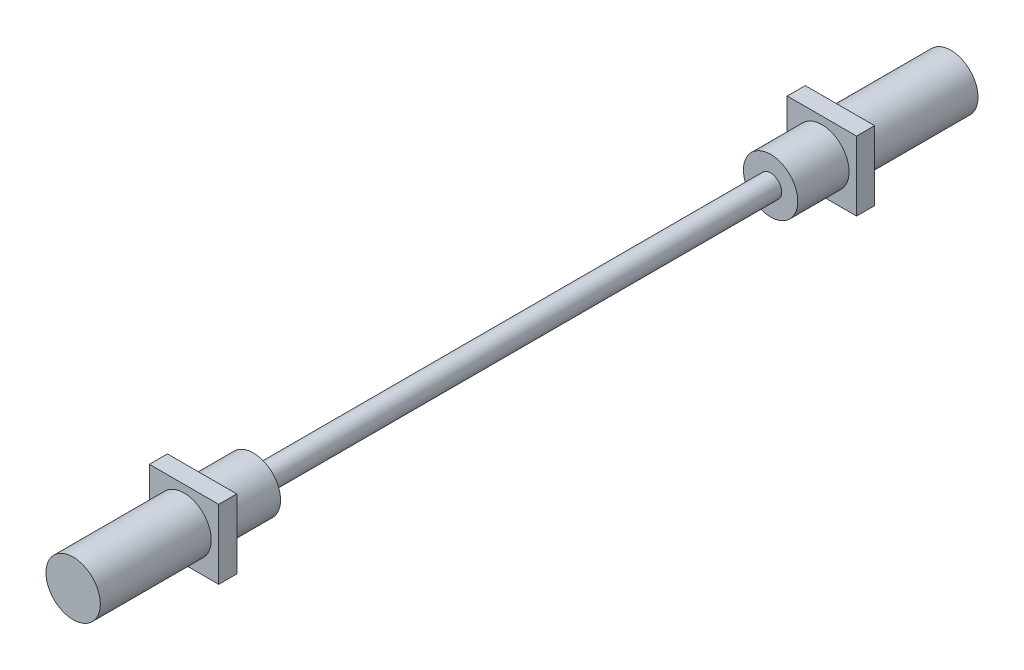
ISO-10303-21;
HEADER;
FILE_DESCRIPTION(('STEP AP214'),'2;1');
FILE_NAME('part.step','',(''),(''),'','','');
FILE_SCHEMA(('AUTOMOTIVE_DESIGN { 1 0 10303 214 1 1 1 1 }'));
ENDSEC;
DATA;
#1=APPLICATION_CONTEXT('core data for automotive mechanical design processes');
#2=APPLICATION_PROTOCOL_DEFINITION('international standard','automotive_design',2000,#1);
#3=PRODUCT_CONTEXT('',#1,'mechanical');
#4=PRODUCT('Part','Part','',(#3));
#5=PRODUCT_RELATED_PRODUCT_CATEGORY('part','',(#4));
#6=PRODUCT_DEFINITION_FORMATION('','',#4);
#7=PRODUCT_DEFINITION_CONTEXT('part definition',#1,'design');
#8=PRODUCT_DEFINITION('design','',#6,#7);
#9=PRODUCT_DEFINITION_SHAPE('','',#8);
#10=(LENGTH_UNIT() NAMED_UNIT(*) SI_UNIT(.MILLI.,.METRE.));
#11=(NAMED_UNIT(*) PLANE_ANGLE_UNIT() SI_UNIT($,.RADIAN.));
#12=(NAMED_UNIT(*) SI_UNIT($,.STERADIAN.) SOLID_ANGLE_UNIT());
#13=UNCERTAINTY_MEASURE_WITH_UNIT(LENGTH_MEASURE(1.E-05),#10,'distance_accuracy_value','');
#14=(GEOMETRIC_REPRESENTATION_CONTEXT(3) GLOBAL_UNCERTAINTY_ASSIGNED_CONTEXT((#13)) GLOBAL_UNIT_ASSIGNED_CONTEXT((#10,
#11,#12)) REPRESENTATION_CONTEXT('',''));
#15=CARTESIAN_POINT('',(0.,0.,0.));
#16=DIRECTION('',(0.,0.,1.));
#17=DIRECTION('',(1.,0.,0.));
#18=AXIS2_PLACEMENT_3D('',#15,#16,#17);
#19=CARTESIAN_POINT('',(0.,0.,47.371));
#20=DIRECTION('',(0.,0.,-1.));
#21=DIRECTION('',(-1.,0.,0.));
#22=AXIS2_PLACEMENT_3D('',#19,#20,#21);
#23=CYLINDRICAL_SURFACE('',#22,1.016);
#24=CARTESIAN_POINT('',(0.,0.,47.371));
#25=DIRECTION('',(0.,0.,1.));
#26=DIRECTION('',(1.,0.,0.));
#27=AXIS2_PLACEMENT_3D('',#24,#25,#26);
#28=CIRCLE('',#27,1.016);
#29=CARTESIAN_POINT('',(1.016,0.,47.371));
#30=VERTEX_POINT('',#29);
#31=EDGE_CURVE('E164',#30,#30,#28,.T.);
#32=ORIENTED_EDGE('',*,*,#31,.F.);
#33=EDGE_LOOP('',(#32));
#34=FACE_BOUND('',#33,.T.);
#35=CARTESIAN_POINT('',(0.,0.,0.));
#36=DIRECTION('',(0.,0.,1.));
#37=DIRECTION('',(1.,0.,0.));
#38=AXIS2_PLACEMENT_3D('',#35,#36,#37);
#39=CIRCLE('',#38,1.016);
#40=CARTESIAN_POINT('',(1.016,0.,0.));
#41=VERTEX_POINT('',#40);
#42=EDGE_CURVE('E48',#41,#41,#39,.T.);
#43=ORIENTED_EDGE('',*,*,#42,.T.);
#44=EDGE_LOOP('',(#43));
#45=FACE_BOUND('',#44,.T.);
#46=ADVANCED_FACE('F45',(#34,#45),#23,.T.);
#47=CARTESIAN_POINT('',(0.,0.,-4.699));
#48=DIRECTION('',(0.,0.,1.));
#49=DIRECTION('',(1.,0.,0.));
#50=AXIS2_PLACEMENT_3D('',#47,#48,#49);
#51=CYLINDRICAL_SURFACE('',#50,2.4892);
#52=CARTESIAN_POINT('',(0.,0.,-4.699));
#53=DIRECTION('',(0.,0.,-1.));
#54=DIRECTION('',(-1.,0.,0.));
#55=AXIS2_PLACEMENT_3D('',#52,#53,#54);
#56=CIRCLE('',#55,2.4892);
#57=CARTESIAN_POINT('',(-2.4892,0.,-4.699));
#58=VERTEX_POINT('',#57);
#59=EDGE_CURVE('E186',#58,#58,#56,.T.);
#60=ORIENTED_EDGE('',*,*,#59,.F.);
#61=EDGE_LOOP('',(#60));
#62=FACE_BOUND('',#61,.T.);
#63=CARTESIAN_POINT('',(0.,0.,0.));
#64=DIRECTION('',(0.,0.,-1.));
#65=DIRECTION('',(-1.,0.,0.));
#66=AXIS2_PLACEMENT_3D('',#63,#64,#65);
#67=CIRCLE('',#66,2.4892);
#68=CARTESIAN_POINT('',(-2.4892,0.,0.));
#69=VERTEX_POINT('',#68);
#70=EDGE_CURVE('E185',#69,#69,#67,.T.);
#71=ORIENTED_EDGE('',*,*,#70,.T.);
#72=EDGE_LOOP('',(#71));
#73=FACE_BOUND('',#72,.T.);
#74=ADVANCED_FACE('F201',(#62,#73),#51,.T.);
#75=CARTESIAN_POINT('',(0.,0.,0.));
#76=DIRECTION('',(0.,0.,-1.));
#77=DIRECTION('',(-1.,0.,0.));
#78=AXIS2_PLACEMENT_3D('',#75,#76,#77);
#79=PLANE('',#78);
#80=ORIENTED_EDGE('',*,*,#42,.F.);
#81=EDGE_LOOP('',(#80));
#82=FACE_BOUND('',#81,.T.);
#83=ORIENTED_EDGE('',*,*,#70,.F.);
#84=EDGE_LOOP('',(#83));
#85=FACE_BOUND('',#84,.T.);
#86=ADVANCED_FACE('F197',(#82,#85),#79,.F.);
#87=CARTESIAN_POINT('',(-3.175,3.175,-6.35));
#88=DIRECTION('',(1.,0.,0.));
#89=DIRECTION('',(0.,1.,0.));
#90=AXIS2_PLACEMENT_3D('',#87,#88,#89);
#91=PLANE('',#90);
#92=DIRECTION('',(0.,1.,0.));
#93=VECTOR('',#92,1.);
#94=CARTESIAN_POINT('',(-3.175,3.175,-4.699));
#95=LINE('',#94,#93);
#96=CARTESIAN_POINT('',(-3.175,-3.175,-4.699));
#97=VERTEX_POINT('',#96);
#98=CARTESIAN_POINT('',(-3.175,3.175,-4.699));
#99=VERTEX_POINT('',#98);
#100=EDGE_CURVE('E161',#97,#99,#95,.T.);
#101=ORIENTED_EDGE('',*,*,#100,.T.);
#102=DIRECTION('',(0.,0.,1.));
#103=VECTOR('',#102,1.);
#104=CARTESIAN_POINT('',(-3.175,3.175,-6.35));
#105=LINE('',#104,#103);
#106=CARTESIAN_POINT('',(-3.175,3.175,-6.35));
#107=VERTEX_POINT('',#106);
#108=EDGE_CURVE('E183',#107,#99,#105,.T.);
#109=ORIENTED_EDGE('',*,*,#108,.F.);
#110=DIRECTION('',(0.,1.,0.));
#111=VECTOR('',#110,1.);
#112=CARTESIAN_POINT('',(-3.175,3.175,-6.35));
#113=LINE('',#112,#111);
#114=CARTESIAN_POINT('',(-3.175,-3.175,-6.35));
#115=VERTEX_POINT('',#114);
#116=EDGE_CURVE('E165',#115,#107,#113,.T.);
#117=ORIENTED_EDGE('',*,*,#116,.F.);
#118=DIRECTION('',(0.,0.,1.));
#119=VECTOR('',#118,1.);
#120=CARTESIAN_POINT('',(-3.175,-3.175,-6.35));
#121=LINE('',#120,#119);
#122=EDGE_CURVE('E171',#115,#97,#121,.T.);
#123=ORIENTED_EDGE('',*,*,#122,.T.);
#124=EDGE_LOOP('',(#101,#109,#117,#123));
#125=FACE_BOUND('',#124,.T.);
#126=ADVANCED_FACE('F200',(#125),#91,.F.);
#127=CARTESIAN_POINT('',(3.175,3.175,-6.35));
#128=DIRECTION('',(0.,-1.,0.));
#129=DIRECTION('',(0.,0.,-1.));
#130=AXIS2_PLACEMENT_3D('',#127,#128,#129);
#131=PLANE('',#130);
#132=DIRECTION('',(1.,0.,0.));
#133=VECTOR('',#132,1.);
#134=CARTESIAN_POINT('',(3.175,3.175,-4.699));
#135=LINE('',#134,#133);
#136=CARTESIAN_POINT('',(3.175,3.175,-4.699));
#137=VERTEX_POINT('',#136);
#138=EDGE_CURVE('E174',#99,#137,#135,.T.);
#139=ORIENTED_EDGE('',*,*,#138,.T.);
#140=DIRECTION('',(0.,0.,1.));
#141=VECTOR('',#140,1.);
#142=CARTESIAN_POINT('',(3.175,3.175,-6.35));
#143=LINE('',#142,#141);
#144=CARTESIAN_POINT('',(3.175,3.175,-6.35));
#145=VERTEX_POINT('',#144);
#146=EDGE_CURVE('E181',#145,#137,#143,.T.);
#147=ORIENTED_EDGE('',*,*,#146,.F.);
#148=DIRECTION('',(1.,0.,0.));
#149=VECTOR('',#148,1.);
#150=CARTESIAN_POINT('',(3.175,3.175,-6.35));
#151=LINE('',#150,#149);
#152=EDGE_CURVE('E95',#107,#145,#151,.T.);
#153=ORIENTED_EDGE('',*,*,#152,.F.);
#154=ORIENTED_EDGE('',*,*,#108,.T.);
#155=EDGE_LOOP('',(#139,#147,#153,#154));
#156=FACE_BOUND('',#155,.T.);
#157=ADVANCED_FACE('F215',(#156),#131,.F.);
#158=CARTESIAN_POINT('',(3.175,3.175,-6.35));
#159=DIRECTION('',(-1.,0.,0.));
#160=DIRECTION('',(0.,-1.,0.));
#161=AXIS2_PLACEMENT_3D('',#158,#159,#160);
#162=PLANE('',#161);
#163=DIRECTION('',(0.,-1.,0.));
#164=VECTOR('',#163,1.);
#165=CARTESIAN_POINT('',(3.175,3.175,-4.699));
#166=LINE('',#165,#164);
#167=CARTESIAN_POINT('',(3.175,-3.175,-4.699));
#168=VERTEX_POINT('',#167);
#169=EDGE_CURVE('E81',#137,#168,#166,.T.);
#170=ORIENTED_EDGE('',*,*,#169,.T.);
#171=DIRECTION('',(0.,0.,1.));
#172=VECTOR('',#171,1.);
#173=CARTESIAN_POINT('',(3.175,-3.175,-6.35));
#174=LINE('',#173,#172);
#175=CARTESIAN_POINT('',(3.175,-3.175,-6.35));
#176=VERTEX_POINT('',#175);
#177=EDGE_CURVE('E179',#176,#168,#174,.T.);
#178=ORIENTED_EDGE('',*,*,#177,.F.);
#179=DIRECTION('',(0.,-1.,0.));
#180=VECTOR('',#179,1.);
#181=CARTESIAN_POINT('',(3.175,3.175,-6.35));
#182=LINE('',#181,#180);
#183=EDGE_CURVE('E168',#145,#176,#182,.T.);
#184=ORIENTED_EDGE('',*,*,#183,.F.);
#185=ORIENTED_EDGE('',*,*,#146,.T.);
#186=EDGE_LOOP('',(#170,#178,#184,#185));
#187=FACE_BOUND('',#186,.T.);
#188=ADVANCED_FACE('F219',(#187),#162,.F.);
#189=CARTESIAN_POINT('',(3.175,-3.175,-6.35));
#190=DIRECTION('',(0.,1.,0.));
#191=DIRECTION('',(0.,0.,1.));
#192=AXIS2_PLACEMENT_3D('',#189,#190,#191);
#193=PLANE('',#192);
#194=DIRECTION('',(-1.,0.,0.));
#195=VECTOR('',#194,1.);
#196=CARTESIAN_POINT('',(3.175,-3.175,-4.699));
#197=LINE('',#196,#195);
#198=EDGE_CURVE('E87',#168,#97,#197,.T.);
#199=ORIENTED_EDGE('',*,*,#198,.T.);
#200=ORIENTED_EDGE('',*,*,#122,.F.);
#201=DIRECTION('',(-1.,0.,0.));
#202=VECTOR('',#201,1.);
#203=CARTESIAN_POINT('',(3.175,-3.175,-6.35));
#204=LINE('',#203,#202);
#205=EDGE_CURVE('E63',#176,#115,#204,.T.);
#206=ORIENTED_EDGE('',*,*,#205,.F.);
#207=ORIENTED_EDGE('',*,*,#177,.T.);
#208=EDGE_LOOP('',(#199,#200,#206,#207));
#209=FACE_BOUND('',#208,.T.);
#210=ADVANCED_FACE('F222',(#209),#193,.F.);
#211=CARTESIAN_POINT('',(0.,0.,-6.35));
#212=DIRECTION('',(0.,0.,-1.));
#213=DIRECTION('',(-1.,0.,0.));
#214=AXIS2_PLACEMENT_3D('',#211,#212,#213);
#215=PLANE('',#214);
#216=CARTESIAN_POINT('',(0.,0.,-6.35));
#217=DIRECTION('',(0.,0.,-1.));
#218=DIRECTION('',(-1.,0.,0.));
#219=AXIS2_PLACEMENT_3D('',#216,#217,#218);
#220=CIRCLE('',#219,2.4892);
#221=CARTESIAN_POINT('',(-2.4892,0.,-6.35));
#222=VERTEX_POINT('',#221);
#223=EDGE_CURVE('E54',#222,#222,#220,.T.);
#224=ORIENTED_EDGE('',*,*,#223,.F.);
#225=EDGE_LOOP('',(#224));
#226=FACE_BOUND('',#225,.T.);
#227=ORIENTED_EDGE('',*,*,#116,.T.);
#228=ORIENTED_EDGE('',*,*,#152,.T.);
#229=ORIENTED_EDGE('',*,*,#183,.T.);
#230=ORIENTED_EDGE('',*,*,#205,.T.);
#231=EDGE_LOOP('',(#227,#228,#229,#230));
#232=FACE_BOUND('',#231,.T.);
#233=ADVANCED_FACE('F225',(#226,#232),#215,.T.);
#234=CARTESIAN_POINT('',(0.,0.,-4.699));
#235=DIRECTION('',(0.,0.,-1.));
#236=DIRECTION('',(-1.,0.,0.));
#237=AXIS2_PLACEMENT_3D('',#234,#235,#236);
#238=PLANE('',#237);
#239=ORIENTED_EDGE('',*,*,#59,.T.);
#240=EDGE_LOOP('',(#239));
#241=FACE_BOUND('',#240,.T.);
#242=ORIENTED_EDGE('',*,*,#100,.F.);
#243=ORIENTED_EDGE('',*,*,#198,.F.);
#244=ORIENTED_EDGE('',*,*,#169,.F.);
#245=ORIENTED_EDGE('',*,*,#138,.F.);
#246=EDGE_LOOP('',(#242,#243,#244,#245));
#247=FACE_BOUND('',#246,.T.);
#248=ADVANCED_FACE('F226',(#241,#247),#238,.F.);
#249=CARTESIAN_POINT('',(0.,0.,-16.51));
#250=DIRECTION('',(0.,0.,1.));
#251=DIRECTION('',(1.,0.,0.));
#252=AXIS2_PLACEMENT_3D('',#249,#250,#251);
#253=CYLINDRICAL_SURFACE('',#252,2.4892);
#254=CARTESIAN_POINT('',(0.,0.,-16.51));
#255=DIRECTION('',(0.,0.,-1.));
#256=DIRECTION('',(-1.,0.,0.));
#257=AXIS2_PLACEMENT_3D('',#254,#255,#256);
#258=CIRCLE('',#257,2.4892);
#259=CARTESIAN_POINT('',(-2.4892,0.,-16.51));
#260=VERTEX_POINT('',#259);
#261=EDGE_CURVE('E157',#260,#260,#258,.T.);
#262=ORIENTED_EDGE('',*,*,#261,.F.);
#263=EDGE_LOOP('',(#262));
#264=FACE_BOUND('',#263,.T.);
#265=ORIENTED_EDGE('',*,*,#223,.T.);
#266=EDGE_LOOP('',(#265));
#267=FACE_BOUND('',#266,.T.);
#268=ADVANCED_FACE('F229',(#264,#267),#253,.T.);
#269=CARTESIAN_POINT('',(0.,0.,-16.51));
#270=DIRECTION('',(0.,0.,-1.));
#271=DIRECTION('',(-1.,0.,0.));
#272=AXIS2_PLACEMENT_3D('',#269,#270,#271);
#273=PLANE('',#272);
#274=ORIENTED_EDGE('',*,*,#261,.T.);
#275=EDGE_LOOP('',(#274));
#276=FACE_BOUND('',#275,.T.);
#277=ADVANCED_FACE('F236',(#276),#273,.T.);
#278=CARTESIAN_POINT('',(0.,0.,52.07));
#279=DIRECTION('',(0.,0.,-1.));
#280=DIRECTION('',(-1.,0.,0.));
#281=AXIS2_PLACEMENT_3D('',#278,#279,#280);
#282=CYLINDRICAL_SURFACE('',#281,2.4892);
#283=CARTESIAN_POINT('',(0.,0.,52.07));
#284=DIRECTION('',(0.,0.,1.));
#285=DIRECTION('',(1.,0.,0.));
#286=AXIS2_PLACEMENT_3D('',#283,#284,#285);
#287=CIRCLE('',#286,2.4892);
#288=CARTESIAN_POINT('',(2.4892,0.,52.07));
#289=VERTEX_POINT('',#288);
#290=EDGE_CURVE('E150',#289,#289,#287,.T.);
#291=ORIENTED_EDGE('',*,*,#290,.F.);
#292=EDGE_LOOP('',(#291));
#293=FACE_BOUND('',#292,.T.);
#294=CARTESIAN_POINT('',(0.,0.,47.371));
#295=DIRECTION('',(0.,0.,1.));
#296=DIRECTION('',(1.,0.,0.));
#297=AXIS2_PLACEMENT_3D('',#294,#295,#296);
#298=CIRCLE('',#297,2.4892);
#299=CARTESIAN_POINT('',(2.4892,0.,47.371));
#300=VERTEX_POINT('',#299);
#301=EDGE_CURVE('E147',#300,#300,#298,.T.);
#302=ORIENTED_EDGE('',*,*,#301,.T.);
#303=EDGE_LOOP('',(#302));
#304=FACE_BOUND('',#303,.T.);
#305=ADVANCED_FACE('F240',(#293,#304),#282,.T.);
#306=CARTESIAN_POINT('',(0.,0.,47.371));
#307=DIRECTION('',(0.,0.,1.));
#308=DIRECTION('',(1.,0.,0.));
#309=AXIS2_PLACEMENT_3D('',#306,#307,#308);
#310=PLANE('',#309);
#311=ORIENTED_EDGE('',*,*,#31,.T.);
#312=EDGE_LOOP('',(#311));
#313=FACE_BOUND('',#312,.T.);
#314=ORIENTED_EDGE('',*,*,#301,.F.);
#315=EDGE_LOOP('',(#314));
#316=FACE_BOUND('',#315,.T.);
#317=ADVANCED_FACE('F244',(#313,#316),#310,.F.);
#318=CARTESIAN_POINT('',(3.175,3.175,53.721));
#319=DIRECTION('',(-1.,0.,0.));
#320=DIRECTION('',(0.,-1.,0.));
#321=AXIS2_PLACEMENT_3D('',#318,#319,#320);
#322=PLANE('',#321);
#323=DIRECTION('',(0.,1.,0.));
#324=VECTOR('',#323,1.);
#325=CARTESIAN_POINT('',(3.175,3.175,52.07));
#326=LINE('',#325,#324);
#327=CARTESIAN_POINT('',(3.175,-3.175,52.07));
#328=VERTEX_POINT('',#327);
#329=CARTESIAN_POINT('',(3.175,3.175,52.07));
#330=VERTEX_POINT('',#329);
#331=EDGE_CURVE('E146',#328,#330,#326,.T.);
#332=ORIENTED_EDGE('',*,*,#331,.T.);
#333=DIRECTION('',(0.,0.,-1.));
#334=VECTOR('',#333,1.);
#335=CARTESIAN_POINT('',(3.175,3.175,53.721));
#336=LINE('',#335,#334);
#337=CARTESIAN_POINT('',(3.175,3.175,53.721));
#338=VERTEX_POINT('',#337);
#339=EDGE_CURVE('E126',#338,#330,#336,.T.);
#340=ORIENTED_EDGE('',*,*,#339,.F.);
#341=DIRECTION('',(0.,1.,0.));
#342=VECTOR('',#341,1.);
#343=CARTESIAN_POINT('',(3.175,3.175,53.721));
#344=LINE('',#343,#342);
#345=CARTESIAN_POINT('',(3.175,-3.175,53.721));
#346=VERTEX_POINT('',#345);
#347=EDGE_CURVE('E133',#346,#338,#344,.T.);
#348=ORIENTED_EDGE('',*,*,#347,.F.);
#349=DIRECTION('',(0.,0.,-1.));
#350=VECTOR('',#349,1.);
#351=CARTESIAN_POINT('',(3.175,-3.175,53.721));
#352=LINE('',#351,#350);
#353=EDGE_CURVE('E284',#346,#328,#352,.T.);
#354=ORIENTED_EDGE('',*,*,#353,.T.);
#355=EDGE_LOOP('',(#332,#340,#348,#354));
#356=FACE_BOUND('',#355,.T.);
#357=ADVANCED_FACE('F144',(#356),#322,.F.);
#358=CARTESIAN_POINT('',(-3.175,3.175,53.721));
#359=DIRECTION('',(0.,-1.,0.));
#360=DIRECTION('',(0.,0.,-1.));
#361=AXIS2_PLACEMENT_3D('',#358,#359,#360);
#362=PLANE('',#361);
#363=DIRECTION('',(-1.,0.,0.));
#364=VECTOR('',#363,1.);
#365=CARTESIAN_POINT('',(-3.175,3.175,52.07));
#366=LINE('',#365,#364);
#367=CARTESIAN_POINT('',(-3.175,3.175,52.07));
#368=VERTEX_POINT('',#367);
#369=EDGE_CURVE('E280',#330,#368,#366,.T.);
#370=ORIENTED_EDGE('',*,*,#369,.T.);
#371=DIRECTION('',(0.,0.,-1.));
#372=VECTOR('',#371,1.);
#373=CARTESIAN_POINT('',(-3.175,3.175,53.721));
#374=LINE('',#373,#372);
#375=CARTESIAN_POINT('',(-3.175,3.175,53.721));
#376=VERTEX_POINT('',#375);
#377=EDGE_CURVE('E129',#376,#368,#374,.T.);
#378=ORIENTED_EDGE('',*,*,#377,.F.);
#379=DIRECTION('',(-1.,0.,0.));
#380=VECTOR('',#379,1.);
#381=CARTESIAN_POINT('',(-3.175,3.175,53.721));
#382=LINE('',#381,#380);
#383=EDGE_CURVE('E122',#338,#376,#382,.T.);
#384=ORIENTED_EDGE('',*,*,#383,.F.);
#385=ORIENTED_EDGE('',*,*,#339,.T.);
#386=EDGE_LOOP('',(#370,#378,#384,#385));
#387=FACE_BOUND('',#386,.T.);
#388=ADVANCED_FACE('F124',(#387),#362,.F.);
#389=CARTESIAN_POINT('',(-3.175,3.175,53.721));
#390=DIRECTION('',(1.,0.,0.));
#391=DIRECTION('',(0.,1.,0.));
#392=AXIS2_PLACEMENT_3D('',#389,#390,#391);
#393=PLANE('',#392);
#394=DIRECTION('',(0.,-1.,0.));
#395=VECTOR('',#394,1.);
#396=CARTESIAN_POINT('',(-3.175,3.175,52.07));
#397=LINE('',#396,#395);
#398=CARTESIAN_POINT('',(-3.175,-3.175,52.07));
#399=VERTEX_POINT('',#398);
#400=EDGE_CURVE('E287',#368,#399,#397,.T.);
#401=ORIENTED_EDGE('',*,*,#400,.T.);
#402=DIRECTION('',(0.,0.,-1.));
#403=VECTOR('',#402,1.);
#404=CARTESIAN_POINT('',(-3.175,-3.175,53.721));
#405=LINE('',#404,#403);
#406=CARTESIAN_POINT('',(-3.175,-3.175,53.721));
#407=VERTEX_POINT('',#406);
#408=EDGE_CURVE('E152',#407,#399,#405,.T.);
#409=ORIENTED_EDGE('',*,*,#408,.F.);
#410=DIRECTION('',(0.,-1.,0.));
#411=VECTOR('',#410,1.);
#412=CARTESIAN_POINT('',(-3.175,3.175,53.721));
#413=LINE('',#412,#411);
#414=EDGE_CURVE('E132',#376,#407,#413,.T.);
#415=ORIENTED_EDGE('',*,*,#414,.F.);
#416=ORIENTED_EDGE('',*,*,#377,.T.);
#417=EDGE_LOOP('',(#401,#409,#415,#416));
#418=FACE_BOUND('',#417,.T.);
#419=ADVANCED_FACE('F252',(#418),#393,.F.);
#420=CARTESIAN_POINT('',(-3.175,-3.175,53.721));
#421=DIRECTION('',(0.,1.,0.));
#422=DIRECTION('',(0.,0.,1.));
#423=AXIS2_PLACEMENT_3D('',#420,#421,#422);
#424=PLANE('',#423);
#425=DIRECTION('',(1.,0.,0.));
#426=VECTOR('',#425,1.);
#427=CARTESIAN_POINT('',(-3.175,-3.175,52.07));
#428=LINE('',#427,#426);
#429=EDGE_CURVE('E142',#399,#328,#428,.T.);
#430=ORIENTED_EDGE('',*,*,#429,.T.);
#431=ORIENTED_EDGE('',*,*,#353,.F.);
#432=DIRECTION('',(1.,0.,0.));
#433=VECTOR('',#432,1.);
#434=CARTESIAN_POINT('',(-3.175,-3.175,53.721));
#435=LINE('',#434,#433);
#436=EDGE_CURVE('E138',#407,#346,#435,.T.);
#437=ORIENTED_EDGE('',*,*,#436,.F.);
#438=ORIENTED_EDGE('',*,*,#408,.T.);
#439=EDGE_LOOP('',(#430,#431,#437,#438));
#440=FACE_BOUND('',#439,.T.);
#441=ADVANCED_FACE('F255',(#440),#424,.F.);
#442=CARTESIAN_POINT('',(0.,0.,53.721));
#443=DIRECTION('',(0.,0.,1.));
#444=DIRECTION('',(1.,0.,0.));
#445=AXIS2_PLACEMENT_3D('',#442,#443,#444);
#446=PLANE('',#445);
#447=CARTESIAN_POINT('',(0.,0.,53.721));
#448=DIRECTION('',(0.,0.,1.));
#449=DIRECTION('',(1.,0.,0.));
#450=AXIS2_PLACEMENT_3D('',#447,#448,#449);
#451=CIRCLE('',#450,2.4892);
#452=CARTESIAN_POINT('',(2.4892,0.,53.721));
#453=VERTEX_POINT('',#452);
#454=EDGE_CURVE('E11',#453,#453,#451,.T.);
#455=ORIENTED_EDGE('',*,*,#454,.F.);
#456=EDGE_LOOP('',(#455));
#457=FACE_BOUND('',#456,.T.);
#458=ORIENTED_EDGE('',*,*,#347,.T.);
#459=ORIENTED_EDGE('',*,*,#383,.T.);
#460=ORIENTED_EDGE('',*,*,#414,.T.);
#461=ORIENTED_EDGE('',*,*,#436,.T.);
#462=EDGE_LOOP('',(#458,#459,#460,#461));
#463=FACE_BOUND('',#462,.T.);
#464=ADVANCED_FACE('F136',(#457,#463),#446,.T.);
#465=CARTESIAN_POINT('',(0.,0.,52.07));
#466=DIRECTION('',(0.,0.,1.));
#467=DIRECTION('',(1.,0.,0.));
#468=AXIS2_PLACEMENT_3D('',#465,#466,#467);
#469=PLANE('',#468);
#470=ORIENTED_EDGE('',*,*,#290,.T.);
#471=EDGE_LOOP('',(#470));
#472=FACE_BOUND('',#471,.T.);
#473=ORIENTED_EDGE('',*,*,#331,.F.);
#474=ORIENTED_EDGE('',*,*,#429,.F.);
#475=ORIENTED_EDGE('',*,*,#400,.F.);
#476=ORIENTED_EDGE('',*,*,#369,.F.);
#477=EDGE_LOOP('',(#473,#474,#475,#476));
#478=FACE_BOUND('',#477,.T.);
#479=ADVANCED_FACE('F260',(#472,#478),#469,.F.);
#480=CARTESIAN_POINT('',(0.,0.,63.881));
#481=DIRECTION('',(0.,0.,-1.));
#482=DIRECTION('',(-1.,0.,0.));
#483=AXIS2_PLACEMENT_3D('',#480,#481,#482);
#484=CYLINDRICAL_SURFACE('',#483,2.4892);
#485=CARTESIAN_POINT('',(0.,0.,63.881));
#486=DIRECTION('',(0.,0.,1.));
#487=DIRECTION('',(1.,0.,0.));
#488=AXIS2_PLACEMENT_3D('',#485,#486,#487);
#489=CIRCLE('',#488,2.4892);
#490=CARTESIAN_POINT('',(2.4892,0.,63.881));
#491=VERTEX_POINT('',#490);
#492=EDGE_CURVE('E278',#491,#491,#489,.T.);
#493=ORIENTED_EDGE('',*,*,#492,.F.);
#494=EDGE_LOOP('',(#493));
#495=FACE_BOUND('',#494,.T.);
#496=ORIENTED_EDGE('',*,*,#454,.T.);
#497=EDGE_LOOP('',(#496));
#498=FACE_BOUND('',#497,.T.);
#499=ADVANCED_FACE('F263',(#495,#498),#484,.T.);
#500=CARTESIAN_POINT('',(0.,0.,63.881));
#501=DIRECTION('',(0.,0.,1.));
#502=DIRECTION('',(1.,0.,0.));
#503=AXIS2_PLACEMENT_3D('',#500,#501,#502);
#504=PLANE('',#503);
#505=ORIENTED_EDGE('',*,*,#492,.T.);
#506=EDGE_LOOP('',(#505));
#507=FACE_BOUND('',#506,.T.);
#508=ADVANCED_FACE('F270',(#507),#504,.T.);
#509=CLOSED_SHELL('',(#46,#74,#86,#126,#157,#188,#210,#233,#248,#268,#277,#305,#317,#357,#388,
#419,#441,#464,#479,#499,#508));
#510=MANIFOLD_SOLID_BREP('B2',#509);
#511=ADVANCED_BREP_SHAPE_REPRESENTATION('',(#18,#510),#14);
#512=SHAPE_DEFINITION_REPRESENTATION(#9,#511);
ENDSEC;
END-ISO-10303-21;
